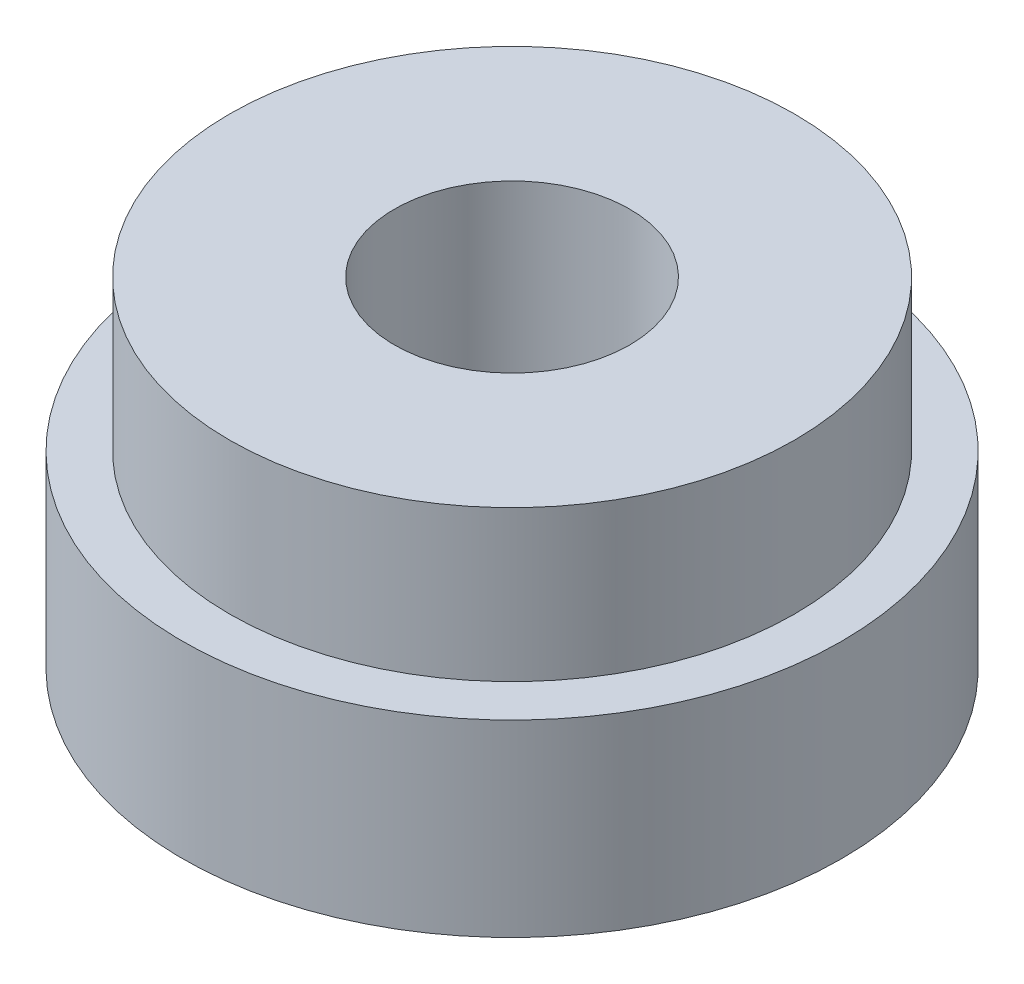
ISO-10303-21;
HEADER;
FILE_DESCRIPTION(('STEP AP214'),'2;1');
FILE_NAME('part.step','',(''),(''),'','','');
FILE_SCHEMA(('AUTOMOTIVE_DESIGN { 1 0 10303 214 1 1 1 1 }'));
ENDSEC;
DATA;
#1=APPLICATION_CONTEXT('core data for automotive mechanical design processes');
#2=APPLICATION_PROTOCOL_DEFINITION('international standard','automotive_design',2000,#1);
#3=PRODUCT_CONTEXT('',#1,'mechanical');
#4=PRODUCT('Part','Part','',(#3));
#5=PRODUCT_RELATED_PRODUCT_CATEGORY('part','',(#4));
#6=PRODUCT_DEFINITION_FORMATION('','',#4);
#7=PRODUCT_DEFINITION_CONTEXT('part definition',#1,'design');
#8=PRODUCT_DEFINITION('design','',#6,#7);
#9=PRODUCT_DEFINITION_SHAPE('','',#8);
#10=(LENGTH_UNIT() NAMED_UNIT(*) SI_UNIT(.MILLI.,.METRE.));
#11=(NAMED_UNIT(*) PLANE_ANGLE_UNIT() SI_UNIT($,.RADIAN.));
#12=(NAMED_UNIT(*) SI_UNIT($,.STERADIAN.) SOLID_ANGLE_UNIT());
#13=UNCERTAINTY_MEASURE_WITH_UNIT(LENGTH_MEASURE(1.E-05),#10,'distance_accuracy_value','');
#14=(GEOMETRIC_REPRESENTATION_CONTEXT(3) GLOBAL_UNCERTAINTY_ASSIGNED_CONTEXT((#13)) GLOBAL_UNIT_ASSIGNED_CONTEXT((#10,
#11,#12)) REPRESENTATION_CONTEXT('',''));
#15=CARTESIAN_POINT('',(0.,0.,0.));
#16=DIRECTION('',(0.,0.,1.));
#17=DIRECTION('',(1.,0.,0.));
#18=AXIS2_PLACEMENT_3D('',#15,#16,#17);
#19=CARTESIAN_POINT('',(3.5,0.,0.));
#20=DIRECTION('',(0.,-1.,0.));
#21=DIRECTION('',(1.,0.,0.));
#22=AXIS2_PLACEMENT_3D('',#19,#20,#21);
#23=PLANE('',#22);
#24=CARTESIAN_POINT('',(0.,0.,0.));
#25=DIRECTION('',(0.,-1.,0.));
#26=DIRECTION('',(1.,0.,0.));
#27=AXIS2_PLACEMENT_3D('',#24,#25,#26);
#28=CIRCLE('',#27,3.5);
#29=CARTESIAN_POINT('',(3.5,0.,0.));
#30=VERTEX_POINT('',#29);
#31=EDGE_CURVE('E52',#30,#30,#28,.T.);
#32=ORIENTED_EDGE('',*,*,#31,.T.);
#33=EDGE_LOOP('',(#32));
#34=FACE_BOUND('',#33,.T.);
#35=CARTESIAN_POINT('',(0.,0.,0.));
#36=DIRECTION('',(0.,-1.,0.));
#37=DIRECTION('',(1.,0.,0.));
#38=AXIS2_PLACEMENT_3D('',#35,#36,#37);
#39=CIRCLE('',#38,1.25);
#40=CARTESIAN_POINT('',(1.25,0.,0.));
#41=VERTEX_POINT('',#40);
#42=EDGE_CURVE('E10',#41,#41,#39,.T.);
#43=ORIENTED_EDGE('',*,*,#42,.F.);
#44=EDGE_LOOP('',(#43));
#45=FACE_BOUND('',#44,.T.);
#46=ADVANCED_FACE('F30',(#34,#45),#23,.T.);
#47=CARTESIAN_POINT('',(0.,0.,0.));
#48=DIRECTION('',(0.,-1.,0.));
#49=DIRECTION('',(1.,0.,0.));
#50=AXIS2_PLACEMENT_3D('',#47,#48,#49);
#51=CYLINDRICAL_SURFACE('',#50,1.25);
#52=ORIENTED_EDGE('',*,*,#42,.T.);
#53=EDGE_LOOP('',(#52));
#54=FACE_BOUND('',#53,.T.);
#55=CARTESIAN_POINT('',(0.,3.6,0.));
#56=DIRECTION('',(0.,-1.,0.));
#57=DIRECTION('',(1.,0.,0.));
#58=AXIS2_PLACEMENT_3D('',#55,#56,#57);
#59=CIRCLE('',#58,1.25);
#60=CARTESIAN_POINT('',(1.25,3.6,0.));
#61=VERTEX_POINT('',#60);
#62=EDGE_CURVE('E36',#61,#61,#59,.T.);
#63=ORIENTED_EDGE('',*,*,#62,.F.);
#64=EDGE_LOOP('',(#63));
#65=FACE_BOUND('',#64,.T.);
#66=ADVANCED_FACE('F70',(#54,#65),#51,.F.);
#67=CARTESIAN_POINT('',(1.25,3.6,0.));
#68=DIRECTION('',(0.,1.,0.));
#69=DIRECTION('',(-1.,0.,0.));
#70=AXIS2_PLACEMENT_3D('',#67,#68,#69);
#71=PLANE('',#70);
#72=ORIENTED_EDGE('',*,*,#62,.T.);
#73=EDGE_LOOP('',(#72));
#74=FACE_BOUND('',#73,.T.);
#75=CARTESIAN_POINT('',(0.,3.6,0.));
#76=DIRECTION('',(0.,-1.,0.));
#77=DIRECTION('',(1.,0.,0.));
#78=AXIS2_PLACEMENT_3D('',#75,#76,#77);
#79=CIRCLE('',#78,3.);
#80=CARTESIAN_POINT('',(3.,3.6,0.));
#81=VERTEX_POINT('',#80);
#82=EDGE_CURVE('E40',#81,#81,#79,.T.);
#83=ORIENTED_EDGE('',*,*,#82,.F.);
#84=EDGE_LOOP('',(#83));
#85=FACE_BOUND('',#84,.T.);
#86=ADVANCED_FACE('F74',(#74,#85),#71,.T.);
#87=CARTESIAN_POINT('',(0.,0.,0.));
#88=DIRECTION('',(0.,-1.,0.));
#89=DIRECTION('',(1.,0.,0.));
#90=AXIS2_PLACEMENT_3D('',#87,#88,#89);
#91=CYLINDRICAL_SURFACE('',#90,3.);
#92=ORIENTED_EDGE('',*,*,#82,.T.);
#93=EDGE_LOOP('',(#92));
#94=FACE_BOUND('',#93,.T.);
#95=CARTESIAN_POINT('',(0.,2.,0.));
#96=DIRECTION('',(0.,-1.,0.));
#97=DIRECTION('',(1.,0.,0.));
#98=AXIS2_PLACEMENT_3D('',#95,#96,#97);
#99=CIRCLE('',#98,3.);
#100=CARTESIAN_POINT('',(3.,2.,0.));
#101=VERTEX_POINT('',#100);
#102=EDGE_CURVE('E44',#101,#101,#99,.T.);
#103=ORIENTED_EDGE('',*,*,#102,.F.);
#104=EDGE_LOOP('',(#103));
#105=FACE_BOUND('',#104,.T.);
#106=ADVANCED_FACE('F66',(#94,#105),#91,.T.);
#107=CARTESIAN_POINT('',(3.,2.,0.));
#108=DIRECTION('',(0.,1.,0.));
#109=DIRECTION('',(-1.,0.,0.));
#110=AXIS2_PLACEMENT_3D('',#107,#108,#109);
#111=PLANE('',#110);
#112=ORIENTED_EDGE('',*,*,#102,.T.);
#113=EDGE_LOOP('',(#112));
#114=FACE_BOUND('',#113,.T.);
#115=CARTESIAN_POINT('',(0.,2.,0.));
#116=DIRECTION('',(0.,-1.,0.));
#117=DIRECTION('',(1.,0.,0.));
#118=AXIS2_PLACEMENT_3D('',#115,#116,#117);
#119=CIRCLE('',#118,3.5);
#120=CARTESIAN_POINT('',(3.5,2.,0.));
#121=VERTEX_POINT('',#120);
#122=EDGE_CURVE('E49',#121,#121,#119,.T.);
#123=ORIENTED_EDGE('',*,*,#122,.F.);
#124=EDGE_LOOP('',(#123));
#125=FACE_BOUND('',#124,.T.);
#126=ADVANCED_FACE('F60',(#114,#125),#111,.T.);
#127=CARTESIAN_POINT('',(0.,0.,0.));
#128=DIRECTION('',(0.,-1.,0.));
#129=DIRECTION('',(1.,0.,0.));
#130=AXIS2_PLACEMENT_3D('',#127,#128,#129);
#131=CYLINDRICAL_SURFACE('',#130,3.5);
#132=ORIENTED_EDGE('',*,*,#122,.T.);
#133=EDGE_LOOP('',(#132));
#134=FACE_BOUND('',#133,.T.);
#135=ORIENTED_EDGE('',*,*,#31,.F.);
#136=EDGE_LOOP('',(#135));
#137=FACE_BOUND('',#136,.T.);
#138=ADVANCED_FACE('F58',(#134,#137),#131,.T.);
#139=CLOSED_SHELL('',(#46,#66,#86,#106,#126,#138));
#140=MANIFOLD_SOLID_BREP('B2',#139);
#141=ADVANCED_BREP_SHAPE_REPRESENTATION('',(#18,#140),#14);
#142=SHAPE_DEFINITION_REPRESENTATION(#9,#141);
ENDSEC;
END-ISO-10303-21;
